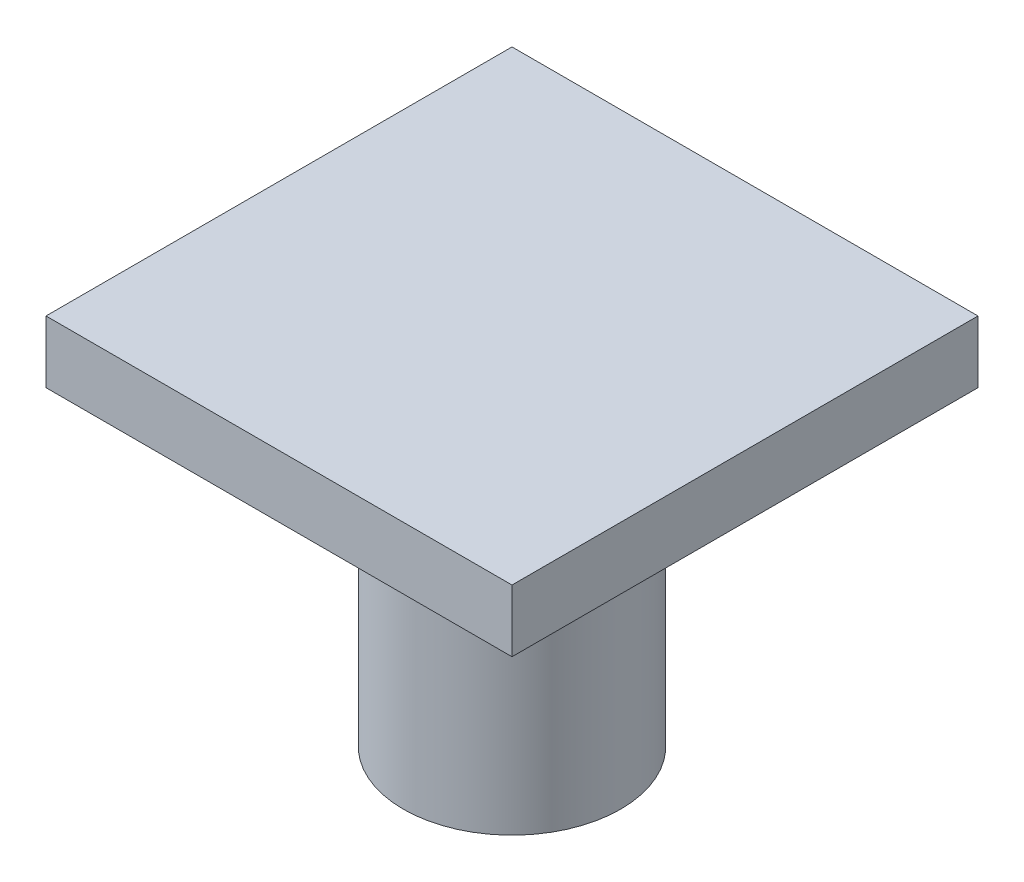
ISO-10303-21;
HEADER;
FILE_DESCRIPTION(('STEP AP214'),'2;1');
FILE_NAME('part.step','',(''),(''),'','','');
FILE_SCHEMA(('AUTOMOTIVE_DESIGN { 1 0 10303 214 1 1 1 1 }'));
ENDSEC;
DATA;
#1=APPLICATION_CONTEXT('core data for automotive mechanical design processes');
#2=APPLICATION_PROTOCOL_DEFINITION('international standard','automotive_design',2000,#1);
#3=PRODUCT_CONTEXT('',#1,'mechanical');
#4=PRODUCT('Part','Part','',(#3));
#5=PRODUCT_RELATED_PRODUCT_CATEGORY('part','',(#4));
#6=PRODUCT_DEFINITION_FORMATION('','',#4);
#7=PRODUCT_DEFINITION_CONTEXT('part definition',#1,'design');
#8=PRODUCT_DEFINITION('design','',#6,#7);
#9=PRODUCT_DEFINITION_SHAPE('','',#8);
#10=(LENGTH_UNIT() NAMED_UNIT(*) SI_UNIT(.MILLI.,.METRE.));
#11=(NAMED_UNIT(*) PLANE_ANGLE_UNIT() SI_UNIT($,.RADIAN.));
#12=(NAMED_UNIT(*) SI_UNIT($,.STERADIAN.) SOLID_ANGLE_UNIT());
#13=UNCERTAINTY_MEASURE_WITH_UNIT(LENGTH_MEASURE(1.E-05),#10,'distance_accuracy_value','');
#14=(GEOMETRIC_REPRESENTATION_CONTEXT(3) GLOBAL_UNCERTAINTY_ASSIGNED_CONTEXT((#13)) GLOBAL_UNIT_ASSIGNED_CONTEXT((#10,
#11,#12)) REPRESENTATION_CONTEXT('',''));
#15=CARTESIAN_POINT('',(0.,0.,0.));
#16=DIRECTION('',(0.,0.,1.));
#17=DIRECTION('',(1.,0.,0.));
#18=AXIS2_PLACEMENT_3D('',#15,#16,#17);
#19=CARTESIAN_POINT('',(0.,-0.999999999999999,0.));
#20=DIRECTION('',(0.,-1.,0.));
#21=DIRECTION('',(0.,0.,-1.));
#22=AXIS2_PLACEMENT_3D('',#19,#20,#21);
#23=TOROIDAL_SURFACE('',#22,1.5,1.);
#24=CARTESIAN_POINT('',(0.,-0.999999999999999,0.));
#25=DIRECTION('',(0.,-1.,0.));
#26=DIRECTION('',(0.,0.,-1.));
#27=AXIS2_PLACEMENT_3D('',#24,#25,#26);
#28=CIRCLE('',#27,2.5);
#29=CARTESIAN_POINT('',(0.,-0.999999999999999,-2.5));
#30=VERTEX_POINT('',#29);
#31=EDGE_CURVE('E52',#30,#30,#28,.F.);
#32=ORIENTED_EDGE('',*,*,#31,.F.);
#33=EDGE_LOOP('',(#32));
#34=FACE_BOUND('',#33,.T.);
#35=CARTESIAN_POINT('',(0.,0.,0.));
#36=DIRECTION('',(0.,-1.,0.));
#37=DIRECTION('',(0.,0.,-1.));
#38=AXIS2_PLACEMENT_3D('',#35,#36,#37);
#39=CIRCLE('',#38,1.5);
#40=CARTESIAN_POINT('',(0.,0.,-1.5));
#41=VERTEX_POINT('',#40);
#42=EDGE_CURVE('E11',#41,#41,#39,.T.);
#43=ORIENTED_EDGE('',*,*,#42,.F.);
#44=EDGE_LOOP('',(#43));
#45=FACE_BOUND('',#44,.T.);
#46=ADVANCED_FACE('F43',(#34,#45),#23,.F.);
#47=CARTESIAN_POINT('',(7.5,2.,7.5));
#48=DIRECTION('',(-1.,0.,0.));
#49=DIRECTION('',(0.,0.,1.));
#50=AXIS2_PLACEMENT_3D('',#47,#48,#49);
#51=PLANE('',#50);
#52=DIRECTION('',(0.,0.,-1.));
#53=VECTOR('',#52,1.);
#54=CARTESIAN_POINT('',(7.5,0.,7.5));
#55=LINE('',#54,#53);
#56=CARTESIAN_POINT('',(7.5,0.,7.5));
#57=VERTEX_POINT('',#56);
#58=CARTESIAN_POINT('',(7.5,0.,-7.5));
#59=VERTEX_POINT('',#58);
#60=EDGE_CURVE('E115',#57,#59,#55,.T.);
#61=ORIENTED_EDGE('',*,*,#60,.T.);
#62=DIRECTION('',(0.,-1.,0.));
#63=VECTOR('',#62,1.);
#64=CARTESIAN_POINT('',(7.5,2.,-7.5));
#65=LINE('',#64,#63);
#66=CARTESIAN_POINT('',(7.5,2.,-7.5));
#67=VERTEX_POINT('',#66);
#68=EDGE_CURVE('E104',#67,#59,#65,.T.);
#69=ORIENTED_EDGE('',*,*,#68,.F.);
#70=DIRECTION('',(0.,0.,-1.));
#71=VECTOR('',#70,1.);
#72=CARTESIAN_POINT('',(7.5,2.,7.5));
#73=LINE('',#72,#71);
#74=CARTESIAN_POINT('',(7.5,2.,7.5));
#75=VERTEX_POINT('',#74);
#76=EDGE_CURVE('E96',#75,#67,#73,.T.);
#77=ORIENTED_EDGE('',*,*,#76,.F.);
#78=DIRECTION('',(0.,-1.,0.));
#79=VECTOR('',#78,1.);
#80=CARTESIAN_POINT('',(7.5,2.,7.5));
#81=LINE('',#80,#79);
#82=EDGE_CURVE('E111',#75,#57,#81,.T.);
#83=ORIENTED_EDGE('',*,*,#82,.T.);
#84=EDGE_LOOP('',(#61,#69,#77,#83));
#85=FACE_BOUND('',#84,.T.);
#86=ADVANCED_FACE('F148',(#85),#51,.F.);
#87=CARTESIAN_POINT('',(-7.5,2.,-7.5));
#88=DIRECTION('',(0.,0.,1.));
#89=DIRECTION('',(1.,0.,0.));
#90=AXIS2_PLACEMENT_3D('',#87,#88,#89);
#91=PLANE('',#90);
#92=DIRECTION('',(-1.,0.,0.));
#93=VECTOR('',#92,1.);
#94=CARTESIAN_POINT('',(-7.5,0.,-7.5));
#95=LINE('',#94,#93);
#96=CARTESIAN_POINT('',(-7.5,0.,-7.5));
#97=VERTEX_POINT('',#96);
#98=EDGE_CURVE('E102',#59,#97,#95,.T.);
#99=ORIENTED_EDGE('',*,*,#98,.T.);
#100=DIRECTION('',(0.,-1.,0.));
#101=VECTOR('',#100,1.);
#102=CARTESIAN_POINT('',(-7.5,2.,-7.5));
#103=LINE('',#102,#101);
#104=CARTESIAN_POINT('',(-7.5,2.,-7.5));
#105=VERTEX_POINT('',#104);
#106=EDGE_CURVE('E100',#105,#97,#103,.T.);
#107=ORIENTED_EDGE('',*,*,#106,.F.);
#108=DIRECTION('',(-1.,0.,0.));
#109=VECTOR('',#108,1.);
#110=CARTESIAN_POINT('',(-7.5,2.,-7.5));
#111=LINE('',#110,#109);
#112=EDGE_CURVE('E91',#67,#105,#111,.T.);
#113=ORIENTED_EDGE('',*,*,#112,.F.);
#114=ORIENTED_EDGE('',*,*,#68,.T.);
#115=EDGE_LOOP('',(#99,#107,#113,#114));
#116=FACE_BOUND('',#115,.T.);
#117=ADVANCED_FACE('F101',(#116),#91,.F.);
#118=CARTESIAN_POINT('',(-7.5,2.,7.5));
#119=DIRECTION('',(1.,0.,0.));
#120=DIRECTION('',(0.,0.,-1.));
#121=AXIS2_PLACEMENT_3D('',#118,#119,#120);
#122=PLANE('',#121);
#123=DIRECTION('',(0.,0.,1.));
#124=VECTOR('',#123,1.);
#125=CARTESIAN_POINT('',(-7.5,0.,7.5));
#126=LINE('',#125,#124);
#127=CARTESIAN_POINT('',(-7.5,0.,7.5));
#128=VERTEX_POINT('',#127);
#129=EDGE_CURVE('E77',#97,#128,#126,.T.);
#130=ORIENTED_EDGE('',*,*,#129,.T.);
#131=DIRECTION('',(0.,-1.,0.));
#132=VECTOR('',#131,1.);
#133=CARTESIAN_POINT('',(-7.5,2.,7.5));
#134=LINE('',#133,#132);
#135=CARTESIAN_POINT('',(-7.5,2.,7.5));
#136=VERTEX_POINT('',#135);
#137=EDGE_CURVE('E105',#136,#128,#134,.T.);
#138=ORIENTED_EDGE('',*,*,#137,.F.);
#139=DIRECTION('',(0.,0.,1.));
#140=VECTOR('',#139,1.);
#141=CARTESIAN_POINT('',(-7.5,2.,7.5));
#142=LINE('',#141,#140);
#143=EDGE_CURVE('E94',#105,#136,#142,.T.);
#144=ORIENTED_EDGE('',*,*,#143,.F.);
#145=ORIENTED_EDGE('',*,*,#106,.T.);
#146=EDGE_LOOP('',(#130,#138,#144,#145));
#147=FACE_BOUND('',#146,.T.);
#148=ADVANCED_FACE('F107',(#147),#122,.F.);
#149=CARTESIAN_POINT('',(-7.5,2.,7.5));
#150=DIRECTION('',(0.,0.,-1.));
#151=DIRECTION('',(-1.,0.,0.));
#152=AXIS2_PLACEMENT_3D('',#149,#150,#151);
#153=PLANE('',#152);
#154=DIRECTION('',(1.,0.,0.));
#155=VECTOR('',#154,1.);
#156=CARTESIAN_POINT('',(-7.5,0.,7.5));
#157=LINE('',#156,#155);
#158=EDGE_CURVE('E83',#128,#57,#157,.T.);
#159=ORIENTED_EDGE('',*,*,#158,.T.);
#160=ORIENTED_EDGE('',*,*,#82,.F.);
#161=DIRECTION('',(1.,0.,0.));
#162=VECTOR('',#161,1.);
#163=CARTESIAN_POINT('',(-7.5,2.,7.5));
#164=LINE('',#163,#162);
#165=EDGE_CURVE('E60',#136,#75,#164,.T.);
#166=ORIENTED_EDGE('',*,*,#165,.F.);
#167=ORIENTED_EDGE('',*,*,#137,.T.);
#168=EDGE_LOOP('',(#159,#160,#166,#167));
#169=FACE_BOUND('',#168,.T.);
#170=ADVANCED_FACE('F174',(#169),#153,.F.);
#171=CARTESIAN_POINT('',(0.,2.,0.));
#172=DIRECTION('',(0.,-1.,0.));
#173=DIRECTION('',(0.,0.,-1.));
#174=AXIS2_PLACEMENT_3D('',#171,#172,#173);
#175=PLANE('',#174);
#176=ORIENTED_EDGE('',*,*,#76,.T.);
#177=ORIENTED_EDGE('',*,*,#112,.T.);
#178=ORIENTED_EDGE('',*,*,#143,.T.);
#179=ORIENTED_EDGE('',*,*,#165,.T.);
#180=EDGE_LOOP('',(#176,#177,#178,#179));
#181=FACE_BOUND('',#180,.T.);
#182=ADVANCED_FACE('F92',(#181),#175,.F.);
#183=CARTESIAN_POINT('',(0.,0.,0.));
#184=DIRECTION('',(0.,-1.,0.));
#185=DIRECTION('',(0.,0.,-1.));
#186=AXIS2_PLACEMENT_3D('',#183,#184,#185);
#187=PLANE('',#186);
#188=CARTESIAN_POINT('',(0.,0.,0.));
#189=DIRECTION('',(0.,-1.,0.));
#190=DIRECTION('',(0.,0.,-1.));
#191=AXIS2_PLACEMENT_3D('',#188,#189,#190);
#192=CIRCLE('',#191,4.5);
#193=CARTESIAN_POINT('',(0.,0.,-4.5));
#194=VERTEX_POINT('',#193);
#195=EDGE_CURVE('E136',#194,#194,#192,.F.);
#196=ORIENTED_EDGE('',*,*,#195,.T.);
#197=EDGE_LOOP('',(#196));
#198=FACE_BOUND('',#197,.T.);
#199=ORIENTED_EDGE('',*,*,#60,.F.);
#200=ORIENTED_EDGE('',*,*,#158,.F.);
#201=ORIENTED_EDGE('',*,*,#129,.F.);
#202=ORIENTED_EDGE('',*,*,#98,.F.);
#203=EDGE_LOOP('',(#199,#200,#201,#202));
#204=FACE_BOUND('',#203,.T.);
#205=ADVANCED_FACE('F155',(#198,#204),#187,.T.);
#206=CARTESIAN_POINT('',(0.,-10.,0.));
#207=DIRECTION('',(0.,-1.,0.));
#208=DIRECTION('',(0.,0.,-1.));
#209=AXIS2_PLACEMENT_3D('',#206,#207,#208);
#210=PLANE('',#209);
#211=CARTESIAN_POINT('',(0.,-10.,0.));
#212=DIRECTION('',(0.,-1.,0.));
#213=DIRECTION('',(0.,0.,-1.));
#214=AXIS2_PLACEMENT_3D('',#211,#212,#213);
#215=CIRCLE('',#214,3.5);
#216=CARTESIAN_POINT('',(0.,-10.,-3.5));
#217=VERTEX_POINT('',#216);
#218=EDGE_CURVE('E119',#217,#217,#215,.T.);
#219=ORIENTED_EDGE('',*,*,#218,.T.);
#220=EDGE_LOOP('',(#219));
#221=FACE_BOUND('',#220,.T.);
#222=CARTESIAN_POINT('',(0.,-10.,0.));
#223=DIRECTION('',(0.,-1.,0.));
#224=DIRECTION('',(0.,0.,-1.));
#225=AXIS2_PLACEMENT_3D('',#222,#223,#224);
#226=CIRCLE('',#225,2.5);
#227=CARTESIAN_POINT('',(0.,-10.,-2.5));
#228=VERTEX_POINT('',#227);
#229=EDGE_CURVE('E286',#228,#228,#226,.T.);
#230=ORIENTED_EDGE('',*,*,#229,.F.);
#231=EDGE_LOOP('',(#230));
#232=FACE_BOUND('',#231,.T.);
#233=ADVANCED_FACE('F166',(#221,#232),#210,.T.);
#234=CARTESIAN_POINT('',(0.,-10.,0.));
#235=DIRECTION('',(0.,1.,0.));
#236=DIRECTION('',(0.,0.,1.));
#237=AXIS2_PLACEMENT_3D('',#234,#235,#236);
#238=CYLINDRICAL_SURFACE('',#237,3.5);
#239=CARTESIAN_POINT('',(0.,-0.999999999999999,0.));
#240=DIRECTION('',(0.,-1.,0.));
#241=DIRECTION('',(0.,0.,-1.));
#242=AXIS2_PLACEMENT_3D('',#239,#240,#241);
#243=CIRCLE('',#242,3.5);
#244=CARTESIAN_POINT('',(0.,-0.999999999999999,-3.5));
#245=VERTEX_POINT('',#244);
#246=EDGE_CURVE('E132',#245,#245,#243,.T.);
#247=ORIENTED_EDGE('',*,*,#246,.T.);
#248=EDGE_LOOP('',(#247));
#249=FACE_BOUND('',#248,.T.);
#250=ORIENTED_EDGE('',*,*,#218,.F.);
#251=EDGE_LOOP('',(#250));
#252=FACE_BOUND('',#251,.T.);
#253=ADVANCED_FACE('F161',(#249,#252),#238,.T.);
#254=CARTESIAN_POINT('',(0.,-10.,0.));
#255=DIRECTION('',(0.,1.,0.));
#256=DIRECTION('',(0.,0.,1.));
#257=AXIS2_PLACEMENT_3D('',#254,#255,#256);
#258=CYLINDRICAL_SURFACE('',#257,2.5);
#259=ORIENTED_EDGE('',*,*,#31,.T.);
#260=EDGE_LOOP('',(#259));
#261=FACE_BOUND('',#260,.T.);
#262=ORIENTED_EDGE('',*,*,#229,.T.);
#263=EDGE_LOOP('',(#262));
#264=FACE_BOUND('',#263,.T.);
#265=ADVANCED_FACE('F143',(#261,#264),#258,.F.);
#266=ORIENTED_EDGE('',*,*,#42,.T.);
#267=EDGE_LOOP('',(#266));
#268=FACE_BOUND('',#267,.T.);
#269=ADVANCED_FACE('F151',(#268),#187,.T.);
#270=CARTESIAN_POINT('',(0.,-0.999999999999999,0.));
#271=DIRECTION('',(0.,-1.,0.));
#272=DIRECTION('',(0.,0.,-1.));
#273=AXIS2_PLACEMENT_3D('',#270,#271,#272);
#274=TOROIDAL_SURFACE('',#273,4.5,1.);
#275=ORIENTED_EDGE('',*,*,#195,.F.);
#276=EDGE_LOOP('',(#275));
#277=FACE_BOUND('',#276,.T.);
#278=ORIENTED_EDGE('',*,*,#246,.F.);
#279=EDGE_LOOP('',(#278));
#280=FACE_BOUND('',#279,.T.);
#281=ADVANCED_FACE('F153',(#277,#280),#274,.F.);
#282=CLOSED_SHELL('',(#46,#86,#117,#148,#170,#182,#205,#233,#253,#265,#269,#281));
#283=MANIFOLD_SOLID_BREP('B2',#282);
#284=ADVANCED_BREP_SHAPE_REPRESENTATION('',(#18,#283),#14);
#285=SHAPE_DEFINITION_REPRESENTATION(#9,#284);
ENDSEC;
END-ISO-10303-21;
